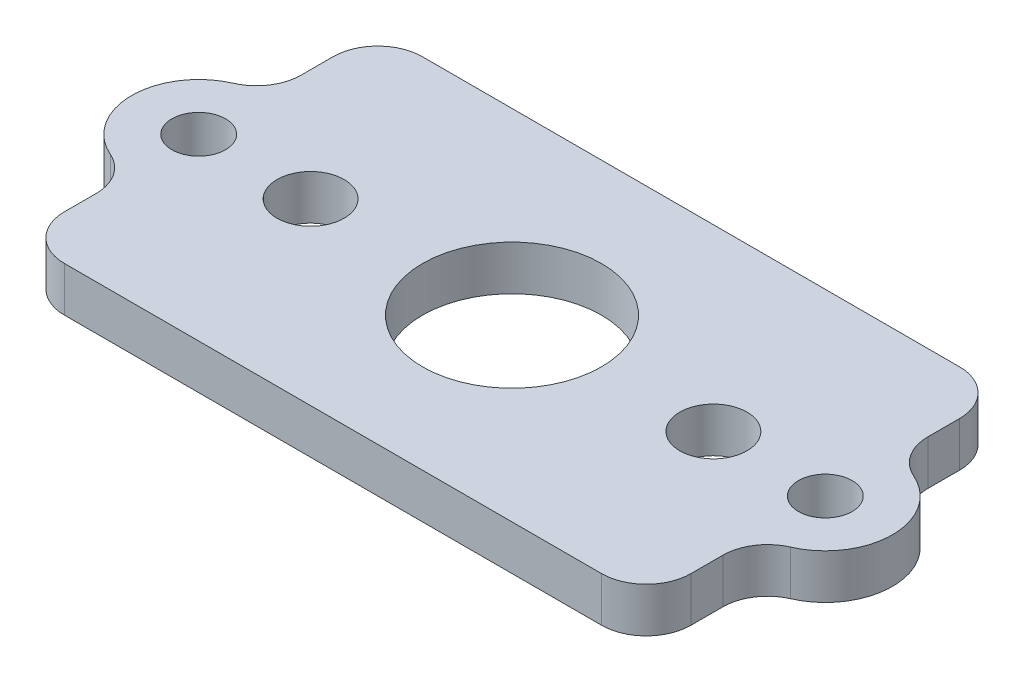
ISO-10303-21;
HEADER;
FILE_DESCRIPTION(('STEP AP214'),'2;1');
FILE_NAME('part.step','',(''),(''),'','','');
FILE_SCHEMA(('AUTOMOTIVE_DESIGN { 1 0 10303 214 1 1 1 1 }'));
ENDSEC;
DATA;
#1=APPLICATION_CONTEXT('core data for automotive mechanical design processes');
#2=APPLICATION_PROTOCOL_DEFINITION('international standard','automotive_design',2000,#1);
#3=PRODUCT_CONTEXT('',#1,'mechanical');
#4=PRODUCT('Part','Part','',(#3));
#5=PRODUCT_RELATED_PRODUCT_CATEGORY('part','',(#4));
#6=PRODUCT_DEFINITION_FORMATION('','',#4);
#7=PRODUCT_DEFINITION_CONTEXT('part definition',#1,'design');
#8=PRODUCT_DEFINITION('design','',#6,#7);
#9=PRODUCT_DEFINITION_SHAPE('','',#8);
#10=(LENGTH_UNIT() NAMED_UNIT(*) SI_UNIT(.MILLI.,.METRE.));
#11=(NAMED_UNIT(*) PLANE_ANGLE_UNIT() SI_UNIT($,.RADIAN.));
#12=(NAMED_UNIT(*) SI_UNIT($,.STERADIAN.) SOLID_ANGLE_UNIT());
#13=UNCERTAINTY_MEASURE_WITH_UNIT(LENGTH_MEASURE(1.E-05),#10,'distance_accuracy_value','');
#14=(GEOMETRIC_REPRESENTATION_CONTEXT(3) GLOBAL_UNCERTAINTY_ASSIGNED_CONTEXT((#13)) GLOBAL_UNIT_ASSIGNED_CONTEXT((#10,
#11,#12)) REPRESENTATION_CONTEXT('',''));
#15=CARTESIAN_POINT('',(0.,0.,0.));
#16=DIRECTION('',(0.,0.,1.));
#17=DIRECTION('',(1.,0.,0.));
#18=AXIS2_PLACEMENT_3D('',#15,#16,#17);
#19=CARTESIAN_POINT('',(0.,0.,4.));
#20=DIRECTION('',(0.,1.,0.));
#21=DIRECTION('',(-1.,0.,0.));
#22=AXIS2_PLACEMENT_3D('',#19,#20,#21);
#23=PLANE('',#22);
#24=DIRECTION('',(0.,0.,-1.));
#25=VECTOR('',#24,1.);
#26=CARTESIAN_POINT('',(7.,0.,4.));
#27=LINE('',#26,#25);
#28=CARTESIAN_POINT('',(7.,0.,3.));
#29=VERTEX_POINT('',#28);
#30=CARTESIAN_POINT('',(7.,0.,2.29128784747792));
#31=VERTEX_POINT('',#30);
#32=EDGE_CURVE('E175',#29,#31,#27,.T.);
#33=ORIENTED_EDGE('',*,*,#32,.F.);
#34=CARTESIAN_POINT('',(6.,0.,3.));
#35=DIRECTION('',(0.,1.,0.));
#36=DIRECTION('',(-1.,0.,0.));
#37=AXIS2_PLACEMENT_3D('',#34,#35,#36);
#38=CIRCLE('',#37,1.);
#39=CARTESIAN_POINT('',(6.,0.,4.));
#40=VERTEX_POINT('',#39);
#41=EDGE_CURVE('E251',#29,#40,#38,.F.);
#42=ORIENTED_EDGE('',*,*,#41,.T.);
#43=DIRECTION('',(1.,0.,0.));
#44=VECTOR('',#43,1.);
#45=CARTESIAN_POINT('',(7.,0.,4.));
#46=LINE('',#45,#44);
#47=CARTESIAN_POINT('',(-6.,0.,4.));
#48=VERTEX_POINT('',#47);
#49=EDGE_CURVE('E194',#48,#40,#46,.T.);
#50=ORIENTED_EDGE('',*,*,#49,.F.);
#51=CARTESIAN_POINT('',(-6.,0.,3.));
#52=DIRECTION('',(0.,1.,0.));
#53=DIRECTION('',(-1.,0.,0.));
#54=AXIS2_PLACEMENT_3D('',#51,#52,#53);
#55=CIRCLE('',#54,1.);
#56=CARTESIAN_POINT('',(-7.,0.,3.));
#57=VERTEX_POINT('',#56);
#58=EDGE_CURVE('E248',#48,#57,#55,.F.);
#59=ORIENTED_EDGE('',*,*,#58,.T.);
#60=DIRECTION('',(0.,0.,-1.));
#61=VECTOR('',#60,1.);
#62=CARTESIAN_POINT('',(-7.,0.,4.));
#63=LINE('',#62,#61);
#64=CARTESIAN_POINT('',(-7.,0.,2.29128784747792));
#65=VERTEX_POINT('',#64);
#66=EDGE_CURVE('E199',#57,#65,#63,.T.);
#67=ORIENTED_EDGE('',*,*,#66,.T.);
#68=CARTESIAN_POINT('',(-8.,0.,2.29128784747792));
#69=DIRECTION('',(0.,1.,0.));
#70=DIRECTION('',(-1.,0.,0.));
#71=AXIS2_PLACEMENT_3D('',#68,#69,#70);
#72=CIRCLE('',#71,1.);
#73=CARTESIAN_POINT('',(-7.6,0.,1.37477270848675));
#74=VERTEX_POINT('',#73);
#75=EDGE_CURVE('E226',#65,#74,#72,.T.);
#76=ORIENTED_EDGE('',*,*,#75,.T.);
#77=CARTESIAN_POINT('',(-7.,0.,0.));
#78=DIRECTION('',(0.,-1.,0.));
#79=DIRECTION('',(1.,0.,0.));
#80=AXIS2_PLACEMENT_3D('',#77,#78,#79);
#81=CIRCLE('',#80,1.5);
#82=CARTESIAN_POINT('',(-7.6,0.,-1.37477270848675));
#83=VERTEX_POINT('',#82);
#84=EDGE_CURVE('E184',#74,#83,#81,.T.);
#85=ORIENTED_EDGE('',*,*,#84,.T.);
#86=CARTESIAN_POINT('',(-8.,0.,-2.29128784747792));
#87=DIRECTION('',(0.,1.,0.));
#88=DIRECTION('',(-1.,0.,0.));
#89=AXIS2_PLACEMENT_3D('',#86,#87,#88);
#90=CIRCLE('',#89,1.);
#91=CARTESIAN_POINT('',(-7.,0.,-2.29128784747792));
#92=VERTEX_POINT('',#91);
#93=EDGE_CURVE('E224',#83,#92,#90,.T.);
#94=ORIENTED_EDGE('',*,*,#93,.T.);
#95=CARTESIAN_POINT('',(-7.,0.,-3.));
#96=VERTEX_POINT('',#95);
#97=EDGE_CURVE('E197',#92,#96,#63,.T.);
#98=ORIENTED_EDGE('',*,*,#97,.T.);
#99=CARTESIAN_POINT('',(-6.,0.,-3.));
#100=DIRECTION('',(0.,1.,0.));
#101=DIRECTION('',(-1.,0.,0.));
#102=AXIS2_PLACEMENT_3D('',#99,#100,#101);
#103=CIRCLE('',#102,1.);
#104=CARTESIAN_POINT('',(-6.,0.,-4.));
#105=VERTEX_POINT('',#104);
#106=EDGE_CURVE('E246',#96,#105,#103,.F.);
#107=ORIENTED_EDGE('',*,*,#106,.T.);
#108=DIRECTION('',(1.,0.,0.));
#109=VECTOR('',#108,1.);
#110=CARTESIAN_POINT('',(0.,0.,-4.));
#111=LINE('',#110,#109);
#112=CARTESIAN_POINT('',(6.,0.,-4.));
#113=VERTEX_POINT('',#112);
#114=EDGE_CURVE('E193',#105,#113,#111,.T.);
#115=ORIENTED_EDGE('',*,*,#114,.T.);
#116=CARTESIAN_POINT('',(6.,0.,-3.));
#117=DIRECTION('',(0.,1.,0.));
#118=DIRECTION('',(-1.,0.,0.));
#119=AXIS2_PLACEMENT_3D('',#116,#117,#118);
#120=CIRCLE('',#119,1.);
#121=CARTESIAN_POINT('',(7.,0.,-3.));
#122=VERTEX_POINT('',#121);
#123=EDGE_CURVE('E52',#113,#122,#120,.F.);
#124=ORIENTED_EDGE('',*,*,#123,.T.);
#125=CARTESIAN_POINT('',(7.,0.,-2.29128784747792));
#126=VERTEX_POINT('',#125);
#127=EDGE_CURVE('E201',#126,#122,#27,.T.);
#128=ORIENTED_EDGE('',*,*,#127,.F.);
#129=CARTESIAN_POINT('',(8.,0.,-2.29128784747792));
#130=DIRECTION('',(0.,1.,0.));
#131=DIRECTION('',(-1.,0.,0.));
#132=AXIS2_PLACEMENT_3D('',#129,#130,#131);
#133=CIRCLE('',#132,1.);
#134=CARTESIAN_POINT('',(7.6,0.,-1.37477270848675));
#135=VERTEX_POINT('',#134);
#136=EDGE_CURVE('E163',#126,#135,#133,.T.);
#137=ORIENTED_EDGE('',*,*,#136,.T.);
#138=CARTESIAN_POINT('',(7.,0.,0.));
#139=DIRECTION('',(0.,-1.,0.));
#140=DIRECTION('',(1.,0.,0.));
#141=AXIS2_PLACEMENT_3D('',#138,#139,#140);
#142=CIRCLE('',#141,1.5);
#143=CARTESIAN_POINT('',(7.6,0.,1.37477270848675));
#144=VERTEX_POINT('',#143);
#145=EDGE_CURVE('E170',#144,#135,#142,.F.);
#146=ORIENTED_EDGE('',*,*,#145,.F.);
#147=CARTESIAN_POINT('',(8.,0.,2.29128784747792));
#148=DIRECTION('',(0.,1.,0.));
#149=DIRECTION('',(-1.,0.,0.));
#150=AXIS2_PLACEMENT_3D('',#147,#148,#149);
#151=CIRCLE('',#150,1.);
#152=EDGE_CURVE('E154',#144,#31,#151,.T.);
#153=ORIENTED_EDGE('',*,*,#152,.T.);
#154=EDGE_LOOP('',(#33,#42,#50,#59,#67,#76,#85,#94,#98,#107,#115,#124,#128,#137,#146,#153));
#155=FACE_BOUND('',#154,.T.);
#156=CARTESIAN_POINT('',(7.,0.,0.));
#157=DIRECTION('',(0.,-1.,0.));
#158=DIRECTION('',(1.,0.,0.));
#159=AXIS2_PLACEMENT_3D('',#156,#157,#158);
#160=CIRCLE('',#159,0.6);
#161=CARTESIAN_POINT('',(7.6,0.,0.));
#162=VERTEX_POINT('',#161);
#163=EDGE_CURVE('E298',#162,#162,#160,.T.);
#164=ORIENTED_EDGE('',*,*,#163,.F.);
#165=EDGE_LOOP('',(#164));
#166=FACE_BOUND('',#165,.T.);
#167=CARTESIAN_POINT('',(-7.,0.,0.));
#168=DIRECTION('',(0.,-1.,0.));
#169=DIRECTION('',(1.,0.,0.));
#170=AXIS2_PLACEMENT_3D('',#167,#168,#169);
#171=CIRCLE('',#170,0.6);
#172=CARTESIAN_POINT('',(-6.4,0.,0.));
#173=VERTEX_POINT('',#172);
#174=EDGE_CURVE('E303',#173,#173,#171,.T.);
#175=ORIENTED_EDGE('',*,*,#174,.F.);
#176=EDGE_LOOP('',(#175));
#177=FACE_BOUND('',#176,.T.);
#178=CARTESIAN_POINT('',(0.,0.,0.));
#179=DIRECTION('',(0.,-1.,0.));
#180=DIRECTION('',(1.,0.,0.));
#181=AXIS2_PLACEMENT_3D('',#178,#179,#180);
#182=CIRCLE('',#181,2.);
#183=CARTESIAN_POINT('',(2.,0.,0.));
#184=VERTEX_POINT('',#183);
#185=EDGE_CURVE('E287',#184,#184,#182,.T.);
#186=ORIENTED_EDGE('',*,*,#185,.F.);
#187=EDGE_LOOP('',(#186));
#188=FACE_BOUND('',#187,.T.);
#189=CARTESIAN_POINT('',(4.5,0.,0.));
#190=DIRECTION('',(0.,1.,0.));
#191=DIRECTION('',(0.,0.,1.));
#192=AXIS2_PLACEMENT_3D('',#189,#190,#191);
#193=CIRCLE('',#192,0.75);
#194=CARTESIAN_POINT('',(4.5,0.,0.75));
#195=VERTEX_POINT('',#194);
#196=EDGE_CURVE('E410',#195,#195,#193,.F.);
#197=ORIENTED_EDGE('',*,*,#196,.F.);
#198=EDGE_LOOP('',(#197));
#199=FACE_BOUND('',#198,.T.);
#200=CARTESIAN_POINT('',(-4.5,0.,0.));
#201=DIRECTION('',(0.,1.,0.));
#202=DIRECTION('',(0.,0.,1.));
#203=AXIS2_PLACEMENT_3D('',#200,#201,#202);
#204=CIRCLE('',#203,0.75);
#205=CARTESIAN_POINT('',(-4.5,0.,0.75));
#206=VERTEX_POINT('',#205);
#207=EDGE_CURVE('E293',#206,#206,#204,.T.);
#208=ORIENTED_EDGE('',*,*,#207,.T.);
#209=EDGE_LOOP('',(#208));
#210=FACE_BOUND('',#209,.T.);
#211=ADVANCED_FACE('F37',(#155,#166,#177,#188,#199,#210),#23,.F.);
#212=CARTESIAN_POINT('',(-7.,1.,0.));
#213=DIRECTION('',(0.,1.,0.));
#214=DIRECTION('',(0.,0.,1.));
#215=AXIS2_PLACEMENT_3D('',#212,#213,#214);
#216=PLANE('',#215);
#217=CARTESIAN_POINT('',(4.5,1.,0.));
#218=DIRECTION('',(0.,1.,0.));
#219=DIRECTION('',(0.,0.,1.));
#220=AXIS2_PLACEMENT_3D('',#217,#218,#219);
#221=CIRCLE('',#220,0.75);
#222=CARTESIAN_POINT('',(4.5,1.,0.75));
#223=VERTEX_POINT('',#222);
#224=EDGE_CURVE('E414',#223,#223,#221,.F.);
#225=ORIENTED_EDGE('',*,*,#224,.T.);
#226=EDGE_LOOP('',(#225));
#227=FACE_BOUND('',#226,.T.);
#228=CARTESIAN_POINT('',(0.,1.,0.));
#229=DIRECTION('',(0.,-1.,0.));
#230=DIRECTION('',(1.,0.,0.));
#231=AXIS2_PLACEMENT_3D('',#228,#229,#230);
#232=CIRCLE('',#231,2.);
#233=CARTESIAN_POINT('',(2.,1.,0.));
#234=VERTEX_POINT('',#233);
#235=EDGE_CURVE('E291',#234,#234,#232,.T.);
#236=ORIENTED_EDGE('',*,*,#235,.T.);
#237=EDGE_LOOP('',(#236));
#238=FACE_BOUND('',#237,.T.);
#239=CARTESIAN_POINT('',(-7.,0.999999999999999,0.));
#240=DIRECTION('',(0.,-1.,0.));
#241=DIRECTION('',(1.,0.,0.));
#242=AXIS2_PLACEMENT_3D('',#239,#240,#241);
#243=CIRCLE('',#242,0.6);
#244=CARTESIAN_POINT('',(-6.4,0.999999999999999,0.));
#245=VERTEX_POINT('',#244);
#246=EDGE_CURVE('E300',#245,#245,#243,.T.);
#247=ORIENTED_EDGE('',*,*,#246,.T.);
#248=EDGE_LOOP('',(#247));
#249=FACE_BOUND('',#248,.T.);
#250=CARTESIAN_POINT('',(7.,1.,0.));
#251=DIRECTION('',(0.,-1.,0.));
#252=DIRECTION('',(1.,0.,0.));
#253=AXIS2_PLACEMENT_3D('',#250,#251,#252);
#254=CIRCLE('',#253,0.6);
#255=CARTESIAN_POINT('',(7.6,1.,0.));
#256=VERTEX_POINT('',#255);
#257=EDGE_CURVE('E306',#256,#256,#254,.T.);
#258=ORIENTED_EDGE('',*,*,#257,.T.);
#259=EDGE_LOOP('',(#258));
#260=FACE_BOUND('',#259,.T.);
#261=DIRECTION('',(1.,0.,0.));
#262=VECTOR('',#261,1.);
#263=CARTESIAN_POINT('',(0.,1.,4.));
#264=LINE('',#263,#262);
#265=CARTESIAN_POINT('',(-6.,1.,4.));
#266=VERTEX_POINT('',#265);
#267=CARTESIAN_POINT('',(6.,1.,4.));
#268=VERTEX_POINT('',#267);
#269=EDGE_CURVE('E280',#266,#268,#264,.T.);
#270=ORIENTED_EDGE('',*,*,#269,.T.);
#271=CARTESIAN_POINT('',(6.,1.,3.));
#272=DIRECTION('',(0.,1.,0.));
#273=DIRECTION('',(0.,0.,1.));
#274=AXIS2_PLACEMENT_3D('',#271,#272,#273);
#275=CIRCLE('',#274,1.);
#276=CARTESIAN_POINT('',(7.,1.,3.));
#277=VERTEX_POINT('',#276);
#278=EDGE_CURVE('E242',#268,#277,#275,.T.);
#279=ORIENTED_EDGE('',*,*,#278,.T.);
#280=DIRECTION('',(0.,0.,1.));
#281=VECTOR('',#280,1.);
#282=CARTESIAN_POINT('',(7.,1.,0.));
#283=LINE('',#282,#281);
#284=CARTESIAN_POINT('',(7.,1.,2.29128784747792));
#285=VERTEX_POINT('',#284);
#286=EDGE_CURVE('E181',#285,#277,#283,.T.);
#287=ORIENTED_EDGE('',*,*,#286,.F.);
#288=CARTESIAN_POINT('',(8.,1.,2.29128784747792));
#289=DIRECTION('',(0.,1.,0.));
#290=DIRECTION('',(0.,0.,1.));
#291=AXIS2_PLACEMENT_3D('',#288,#289,#290);
#292=CIRCLE('',#291,1.);
#293=CARTESIAN_POINT('',(7.6,1.,1.37477270848675));
#294=VERTEX_POINT('',#293);
#295=EDGE_CURVE('E162',#285,#294,#292,.F.);
#296=ORIENTED_EDGE('',*,*,#295,.T.);
#297=CARTESIAN_POINT('',(7.,1.,0.));
#298=DIRECTION('',(0.,-1.,0.));
#299=DIRECTION('',(1.,0.,0.));
#300=AXIS2_PLACEMENT_3D('',#297,#298,#299);
#301=CIRCLE('',#300,1.5);
#302=CARTESIAN_POINT('',(7.6,1.,-1.37477270848675));
#303=VERTEX_POINT('',#302);
#304=EDGE_CURVE('E173',#294,#303,#301,.F.);
#305=ORIENTED_EDGE('',*,*,#304,.T.);
#306=CARTESIAN_POINT('',(8.,1.,-2.29128784747792));
#307=DIRECTION('',(0.,1.,0.));
#308=DIRECTION('',(0.,0.,1.));
#309=AXIS2_PLACEMENT_3D('',#306,#307,#308);
#310=CIRCLE('',#309,1.);
#311=CARTESIAN_POINT('',(7.,1.,-2.29128784747792));
#312=VERTEX_POINT('',#311);
#313=EDGE_CURVE('E217',#303,#312,#310,.F.);
#314=ORIENTED_EDGE('',*,*,#313,.T.);
#315=CARTESIAN_POINT('',(7.,1.,-3.));
#316=VERTEX_POINT('',#315);
#317=EDGE_CURVE('E188',#316,#312,#283,.T.);
#318=ORIENTED_EDGE('',*,*,#317,.F.);
#319=CARTESIAN_POINT('',(6.,0.999999999999999,-3.));
#320=DIRECTION('',(0.,1.,0.));
#321=DIRECTION('',(0.,0.,1.));
#322=AXIS2_PLACEMENT_3D('',#319,#320,#321);
#323=CIRCLE('',#322,1.);
#324=CARTESIAN_POINT('',(6.,1.,-4.));
#325=VERTEX_POINT('',#324);
#326=EDGE_CURVE('E240',#316,#325,#323,.T.);
#327=ORIENTED_EDGE('',*,*,#326,.T.);
#328=DIRECTION('',(1.,0.,0.));
#329=VECTOR('',#328,1.);
#330=CARTESIAN_POINT('',(0.,1.,-4.));
#331=LINE('',#330,#329);
#332=CARTESIAN_POINT('',(-6.,1.,-4.));
#333=VERTEX_POINT('',#332);
#334=EDGE_CURVE('E288',#333,#325,#331,.T.);
#335=ORIENTED_EDGE('',*,*,#334,.F.);
#336=CARTESIAN_POINT('',(-6.,1.,-3.));
#337=DIRECTION('',(0.,1.,0.));
#338=DIRECTION('',(0.,0.,1.));
#339=AXIS2_PLACEMENT_3D('',#336,#337,#338);
#340=CIRCLE('',#339,1.);
#341=CARTESIAN_POINT('',(-7.,1.,-3.));
#342=VERTEX_POINT('',#341);
#343=EDGE_CURVE('E236',#333,#342,#340,.T.);
#344=ORIENTED_EDGE('',*,*,#343,.T.);
#345=DIRECTION('',(0.,0.,1.));
#346=VECTOR('',#345,1.);
#347=CARTESIAN_POINT('',(-7.,1.,0.));
#348=LINE('',#347,#346);
#349=CARTESIAN_POINT('',(-7.,1.,-2.29128784747792));
#350=VERTEX_POINT('',#349);
#351=EDGE_CURVE('E191',#342,#350,#348,.T.);
#352=ORIENTED_EDGE('',*,*,#351,.T.);
#353=CARTESIAN_POINT('',(-8.,1.,-2.29128784747792));
#354=DIRECTION('',(0.,1.,0.));
#355=DIRECTION('',(0.,0.,1.));
#356=AXIS2_PLACEMENT_3D('',#353,#354,#355);
#357=CIRCLE('',#356,1.);
#358=CARTESIAN_POINT('',(-7.6,0.999999999999999,-1.37477270848675));
#359=VERTEX_POINT('',#358);
#360=EDGE_CURVE('E222',#350,#359,#357,.F.);
#361=ORIENTED_EDGE('',*,*,#360,.T.);
#362=CARTESIAN_POINT('',(-7.,0.999999999999999,0.));
#363=DIRECTION('',(0.,-1.,0.));
#364=DIRECTION('',(1.,0.,0.));
#365=AXIS2_PLACEMENT_3D('',#362,#363,#364);
#366=CIRCLE('',#365,1.5);
#367=CARTESIAN_POINT('',(-7.6,0.999999999999999,1.37477270848675));
#368=VERTEX_POINT('',#367);
#369=EDGE_CURVE('E179',#368,#359,#366,.T.);
#370=ORIENTED_EDGE('',*,*,#369,.F.);
#371=CARTESIAN_POINT('',(-8.,1.,2.29128784747792));
#372=DIRECTION('',(0.,1.,0.));
#373=DIRECTION('',(0.,0.,1.));
#374=AXIS2_PLACEMENT_3D('',#371,#372,#373);
#375=CIRCLE('',#374,1.);
#376=CARTESIAN_POINT('',(-7.,1.,2.29128784747792));
#377=VERTEX_POINT('',#376);
#378=EDGE_CURVE('E228',#368,#377,#375,.F.);
#379=ORIENTED_EDGE('',*,*,#378,.T.);
#380=CARTESIAN_POINT('',(-7.,1.,3.));
#381=VERTEX_POINT('',#380);
#382=EDGE_CURVE('E190',#377,#381,#348,.T.);
#383=ORIENTED_EDGE('',*,*,#382,.T.);
#384=CARTESIAN_POINT('',(-6.,1.,3.));
#385=DIRECTION('',(0.,1.,0.));
#386=DIRECTION('',(0.,0.,1.));
#387=AXIS2_PLACEMENT_3D('',#384,#385,#386);
#388=CIRCLE('',#387,1.);
#389=EDGE_CURVE('E238',#381,#266,#388,.T.);
#390=ORIENTED_EDGE('',*,*,#389,.T.);
#391=EDGE_LOOP('',(#270,#279,#287,#296,#305,#314,#318,#327,#335,#344,#352,#361,#370,#379,#383,#390));
#392=FACE_BOUND('',#391,.T.);
#393=CARTESIAN_POINT('',(-4.5,1.,0.));
#394=DIRECTION('',(0.,1.,0.));
#395=DIRECTION('',(0.,0.,1.));
#396=AXIS2_PLACEMENT_3D('',#393,#394,#395);
#397=CIRCLE('',#396,0.75);
#398=CARTESIAN_POINT('',(-4.5,1.,0.75));
#399=VERTEX_POINT('',#398);
#400=EDGE_CURVE('E409',#399,#399,#397,.T.);
#401=ORIENTED_EDGE('',*,*,#400,.F.);
#402=EDGE_LOOP('',(#401));
#403=FACE_BOUND('',#402,.T.);
#404=ADVANCED_FACE('F269',(#227,#238,#249,#260,#392,#403),#216,.T.);
#405=CARTESIAN_POINT('',(-7.,0.,4.));
#406=DIRECTION('',(1.,0.,0.));
#407=DIRECTION('',(0.,0.,-1.));
#408=AXIS2_PLACEMENT_3D('',#405,#406,#407);
#409=PLANE('',#408);
#410=ORIENTED_EDGE('',*,*,#66,.F.);
#411=DIRECTION('',(0.,-1.,0.));
#412=VECTOR('',#411,1.);
#413=CARTESIAN_POINT('',(-7.,0.,3.));
#414=LINE('',#413,#412);
#415=EDGE_CURVE('E45',#57,#381,#414,.F.);
#416=ORIENTED_EDGE('',*,*,#415,.T.);
#417=ORIENTED_EDGE('',*,*,#382,.F.);
#418=DIRECTION('',(0.,-1.,0.));
#419=VECTOR('',#418,1.);
#420=CARTESIAN_POINT('',(-7.,0.,2.29128784747792));
#421=LINE('',#420,#419);
#422=EDGE_CURVE('E214',#377,#65,#421,.T.);
#423=ORIENTED_EDGE('',*,*,#422,.T.);
#424=EDGE_LOOP('',(#410,#416,#417,#423));
#425=FACE_BOUND('',#424,.T.);
#426=ADVANCED_FACE('F263',(#425),#409,.F.);
#427=CARTESIAN_POINT('',(7.,8.,4.));
#428=DIRECTION('',(-1.,0.,0.));
#429=DIRECTION('',(0.,-1.,0.));
#430=AXIS2_PLACEMENT_3D('',#427,#428,#429);
#431=PLANE('',#430);
#432=ORIENTED_EDGE('',*,*,#127,.T.);
#433=DIRECTION('',(0.,1.,0.));
#434=VECTOR('',#433,1.);
#435=CARTESIAN_POINT('',(7.,0.999999999999999,-3.));
#436=LINE('',#435,#434);
#437=EDGE_CURVE('E253',#122,#316,#436,.T.);
#438=ORIENTED_EDGE('',*,*,#437,.T.);
#439=ORIENTED_EDGE('',*,*,#317,.T.);
#440=DIRECTION('',(0.,1.,0.));
#441=VECTOR('',#440,1.);
#442=CARTESIAN_POINT('',(7.,0.,-2.29128784747792));
#443=LINE('',#442,#441);
#444=EDGE_CURVE('E204',#312,#126,#443,.F.);
#445=ORIENTED_EDGE('',*,*,#444,.T.);
#446=EDGE_LOOP('',(#432,#438,#439,#445));
#447=FACE_BOUND('',#446,.T.);
#448=ADVANCED_FACE('F337',(#447),#431,.F.);
#449=ORIENTED_EDGE('',*,*,#286,.T.);
#450=DIRECTION('',(0.,1.,0.));
#451=VECTOR('',#450,1.);
#452=CARTESIAN_POINT('',(7.,8.,3.));
#453=LINE('',#452,#451);
#454=EDGE_CURVE('E244',#277,#29,#453,.F.);
#455=ORIENTED_EDGE('',*,*,#454,.T.);
#456=ORIENTED_EDGE('',*,*,#32,.T.);
#457=DIRECTION('',(0.,1.,0.));
#458=VECTOR('',#457,1.);
#459=CARTESIAN_POINT('',(7.,1.,2.29128784747792));
#460=LINE('',#459,#458);
#461=EDGE_CURVE('E159',#31,#285,#460,.T.);
#462=ORIENTED_EDGE('',*,*,#461,.T.);
#463=EDGE_LOOP('',(#449,#455,#456,#462));
#464=FACE_BOUND('',#463,.T.);
#465=ADVANCED_FACE('F365',(#464),#431,.F.);
#466=ORIENTED_EDGE('',*,*,#351,.F.);
#467=DIRECTION('',(0.,-1.,0.));
#468=VECTOR('',#467,1.);
#469=CARTESIAN_POINT('',(-7.,0.,-3.));
#470=LINE('',#469,#468);
#471=EDGE_CURVE('E11',#342,#96,#470,.T.);
#472=ORIENTED_EDGE('',*,*,#471,.T.);
#473=ORIENTED_EDGE('',*,*,#97,.F.);
#474=DIRECTION('',(0.,-1.,0.));
#475=VECTOR('',#474,1.);
#476=CARTESIAN_POINT('',(-7.,0.,-2.29128784747792));
#477=LINE('',#476,#475);
#478=EDGE_CURVE('E207',#92,#350,#477,.F.);
#479=ORIENTED_EDGE('',*,*,#478,.T.);
#480=EDGE_LOOP('',(#466,#472,#473,#479));
#481=FACE_BOUND('',#480,.T.);
#482=ADVANCED_FACE('F325',(#481),#409,.F.);
#483=CARTESIAN_POINT('',(0.,0.,4.));
#484=DIRECTION('',(0.,0.,-1.));
#485=DIRECTION('',(-1.,0.,0.));
#486=AXIS2_PLACEMENT_3D('',#483,#484,#485);
#487=PLANE('',#486);
#488=ORIENTED_EDGE('',*,*,#49,.T.);
#489=DIRECTION('',(0.,1.,0.));
#490=VECTOR('',#489,1.);
#491=CARTESIAN_POINT('',(6.,0.,4.));
#492=LINE('',#491,#490);
#493=EDGE_CURVE('E233',#40,#268,#492,.T.);
#494=ORIENTED_EDGE('',*,*,#493,.T.);
#495=ORIENTED_EDGE('',*,*,#269,.F.);
#496=DIRECTION('',(0.,-1.,0.));
#497=VECTOR('',#496,1.);
#498=CARTESIAN_POINT('',(-6.,0.,4.));
#499=LINE('',#498,#497);
#500=EDGE_CURVE('E230',#266,#48,#499,.T.);
#501=ORIENTED_EDGE('',*,*,#500,.T.);
#502=EDGE_LOOP('',(#488,#494,#495,#501));
#503=FACE_BOUND('',#502,.T.);
#504=ADVANCED_FACE('F278',(#503),#487,.F.);
#505=CARTESIAN_POINT('',(0.,0.,-4.));
#506=DIRECTION('',(0.,0.,-1.));
#507=DIRECTION('',(-1.,0.,0.));
#508=AXIS2_PLACEMENT_3D('',#505,#506,#507);
#509=PLANE('',#508);
#510=ORIENTED_EDGE('',*,*,#334,.T.);
#511=DIRECTION('',(0.,1.,0.));
#512=VECTOR('',#511,1.);
#513=CARTESIAN_POINT('',(6.,0.,-4.));
#514=LINE('',#513,#512);
#515=EDGE_CURVE('E60',#325,#113,#514,.F.);
#516=ORIENTED_EDGE('',*,*,#515,.T.);
#517=ORIENTED_EDGE('',*,*,#114,.F.);
#518=DIRECTION('',(0.,-1.,0.));
#519=VECTOR('',#518,1.);
#520=CARTESIAN_POINT('',(-6.,1.,-4.));
#521=LINE('',#520,#519);
#522=EDGE_CURVE('E256',#105,#333,#521,.F.);
#523=ORIENTED_EDGE('',*,*,#522,.T.);
#524=EDGE_LOOP('',(#510,#516,#517,#523));
#525=FACE_BOUND('',#524,.T.);
#526=ADVANCED_FACE('F329',(#525),#509,.T.);
#527=CARTESIAN_POINT('',(7.,1.,0.));
#528=DIRECTION('',(0.,-1.,0.));
#529=DIRECTION('',(1.,0.,0.));
#530=AXIS2_PLACEMENT_3D('',#527,#528,#529);
#531=CYLINDRICAL_SURFACE('',#530,1.5);
#532=ORIENTED_EDGE('',*,*,#145,.T.);
#533=DIRECTION('',(0.,-1.,0.));
#534=VECTOR('',#533,1.);
#535=CARTESIAN_POINT('',(7.6,1.,-1.37477270848675));
#536=LINE('',#535,#534);
#537=EDGE_CURVE('E174',#135,#303,#536,.F.);
#538=ORIENTED_EDGE('',*,*,#537,.T.);
#539=ORIENTED_EDGE('',*,*,#304,.F.);
#540=DIRECTION('',(0.,-1.,0.));
#541=VECTOR('',#540,1.);
#542=CARTESIAN_POINT('',(7.6,1.,1.37477270848675));
#543=LINE('',#542,#541);
#544=EDGE_CURVE('E158',#294,#144,#543,.T.);
#545=ORIENTED_EDGE('',*,*,#544,.T.);
#546=EDGE_LOOP('',(#532,#538,#539,#545));
#547=FACE_BOUND('',#546,.T.);
#548=ADVANCED_FACE('F168',(#547),#531,.T.);
#549=CARTESIAN_POINT('',(-7.,0.999999999999999,0.));
#550=DIRECTION('',(0.,-1.,0.));
#551=DIRECTION('',(1.,0.,0.));
#552=AXIS2_PLACEMENT_3D('',#549,#550,#551);
#553=CYLINDRICAL_SURFACE('',#552,1.5);
#554=ORIENTED_EDGE('',*,*,#369,.T.);
#555=DIRECTION('',(0.,-1.,0.));
#556=VECTOR('',#555,1.);
#557=CARTESIAN_POINT('',(-7.6,0.999999999999999,-1.37477270848675));
#558=LINE('',#557,#556);
#559=EDGE_CURVE('E212',#359,#83,#558,.T.);
#560=ORIENTED_EDGE('',*,*,#559,.T.);
#561=ORIENTED_EDGE('',*,*,#84,.F.);
#562=DIRECTION('',(0.,-1.,0.));
#563=VECTOR('',#562,1.);
#564=CARTESIAN_POINT('',(-7.6,0.999999999999999,1.37477270848675));
#565=LINE('',#564,#563);
#566=EDGE_CURVE('E210',#74,#368,#565,.F.);
#567=ORIENTED_EDGE('',*,*,#566,.T.);
#568=EDGE_LOOP('',(#554,#560,#561,#567));
#569=FACE_BOUND('',#568,.T.);
#570=ADVANCED_FACE('F382',(#569),#553,.T.);
#571=CARTESIAN_POINT('',(7.,1.,0.));
#572=DIRECTION('',(0.,-1.,0.));
#573=DIRECTION('',(1.,0.,0.));
#574=AXIS2_PLACEMENT_3D('',#571,#572,#573);
#575=CYLINDRICAL_SURFACE('',#574,0.6);
#576=ORIENTED_EDGE('',*,*,#257,.F.);
#577=EDGE_LOOP('',(#576));
#578=FACE_BOUND('',#577,.T.);
#579=ORIENTED_EDGE('',*,*,#163,.T.);
#580=EDGE_LOOP('',(#579));
#581=FACE_BOUND('',#580,.T.);
#582=ADVANCED_FACE('F349',(#578,#581),#575,.F.);
#583=CARTESIAN_POINT('',(-7.,0.999999999999999,0.));
#584=DIRECTION('',(0.,-1.,0.));
#585=DIRECTION('',(1.,0.,0.));
#586=AXIS2_PLACEMENT_3D('',#583,#584,#585);
#587=CYLINDRICAL_SURFACE('',#586,0.6);
#588=ORIENTED_EDGE('',*,*,#246,.F.);
#589=EDGE_LOOP('',(#588));
#590=FACE_BOUND('',#589,.T.);
#591=ORIENTED_EDGE('',*,*,#174,.T.);
#592=EDGE_LOOP('',(#591));
#593=FACE_BOUND('',#592,.T.);
#594=ADVANCED_FACE('F342',(#590,#593),#587,.F.);
#595=CARTESIAN_POINT('',(8.,1.,-2.29128784747792));
#596=DIRECTION('',(0.,-1.,0.));
#597=DIRECTION('',(1.,0.,0.));
#598=AXIS2_PLACEMENT_3D('',#595,#596,#597);
#599=CYLINDRICAL_SURFACE('',#598,1.);
#600=ORIENTED_EDGE('',*,*,#136,.F.);
#601=ORIENTED_EDGE('',*,*,#444,.F.);
#602=ORIENTED_EDGE('',*,*,#313,.F.);
#603=ORIENTED_EDGE('',*,*,#537,.F.);
#604=EDGE_LOOP('',(#600,#601,#602,#603));
#605=FACE_BOUND('',#604,.T.);
#606=ADVANCED_FACE('F340',(#605),#599,.F.);
#607=CARTESIAN_POINT('',(8.,1.,2.29128784747792));
#608=DIRECTION('',(0.,-1.,0.));
#609=DIRECTION('',(1.,0.,0.));
#610=AXIS2_PLACEMENT_3D('',#607,#608,#609);
#611=CYLINDRICAL_SURFACE('',#610,1.);
#612=ORIENTED_EDGE('',*,*,#295,.F.);
#613=ORIENTED_EDGE('',*,*,#461,.F.);
#614=ORIENTED_EDGE('',*,*,#152,.F.);
#615=ORIENTED_EDGE('',*,*,#544,.F.);
#616=EDGE_LOOP('',(#612,#613,#614,#615));
#617=FACE_BOUND('',#616,.T.);
#618=ADVANCED_FACE('F157',(#617),#611,.F.);
#619=CARTESIAN_POINT('',(-8.,0.999999999999999,-2.29128784747792));
#620=DIRECTION('',(0.,-1.,0.));
#621=DIRECTION('',(1.,0.,0.));
#622=AXIS2_PLACEMENT_3D('',#619,#620,#621);
#623=CYLINDRICAL_SURFACE('',#622,1.);
#624=ORIENTED_EDGE('',*,*,#93,.F.);
#625=ORIENTED_EDGE('',*,*,#559,.F.);
#626=ORIENTED_EDGE('',*,*,#360,.F.);
#627=ORIENTED_EDGE('',*,*,#478,.F.);
#628=EDGE_LOOP('',(#624,#625,#626,#627));
#629=FACE_BOUND('',#628,.T.);
#630=ADVANCED_FACE('F321',(#629),#623,.F.);
#631=CARTESIAN_POINT('',(-8.,0.999999999999999,2.29128784747792));
#632=DIRECTION('',(0.,-1.,0.));
#633=DIRECTION('',(1.,0.,0.));
#634=AXIS2_PLACEMENT_3D('',#631,#632,#633);
#635=CYLINDRICAL_SURFACE('',#634,1.);
#636=ORIENTED_EDGE('',*,*,#378,.F.);
#637=ORIENTED_EDGE('',*,*,#566,.F.);
#638=ORIENTED_EDGE('',*,*,#75,.F.);
#639=ORIENTED_EDGE('',*,*,#422,.F.);
#640=EDGE_LOOP('',(#636,#637,#638,#639));
#641=FACE_BOUND('',#640,.T.);
#642=ADVANCED_FACE('F392',(#641),#635,.F.);
#643=CARTESIAN_POINT('',(0.,1.,0.));
#644=DIRECTION('',(0.,-1.,0.));
#645=DIRECTION('',(1.,0.,0.));
#646=AXIS2_PLACEMENT_3D('',#643,#644,#645);
#647=CYLINDRICAL_SURFACE('',#646,2.);
#648=ORIENTED_EDGE('',*,*,#235,.F.);
#649=EDGE_LOOP('',(#648));
#650=FACE_BOUND('',#649,.T.);
#651=ORIENTED_EDGE('',*,*,#185,.T.);
#652=EDGE_LOOP('',(#651));
#653=FACE_BOUND('',#652,.T.);
#654=ADVANCED_FACE('F388',(#650,#653),#647,.F.);
#655=CARTESIAN_POINT('',(4.5,0.,0.));
#656=DIRECTION('',(0.,1.,0.));
#657=DIRECTION('',(0.,0.,1.));
#658=AXIS2_PLACEMENT_3D('',#655,#656,#657);
#659=CYLINDRICAL_SURFACE('',#658,0.75);
#660=ORIENTED_EDGE('',*,*,#196,.T.);
#661=EDGE_LOOP('',(#660));
#662=FACE_BOUND('',#661,.T.);
#663=ORIENTED_EDGE('',*,*,#224,.F.);
#664=EDGE_LOOP('',(#663));
#665=FACE_BOUND('',#664,.T.);
#666=ADVANCED_FACE('F391',(#662,#665),#659,.F.);
#667=CARTESIAN_POINT('',(-4.5,0.,0.));
#668=DIRECTION('',(0.,1.,0.));
#669=DIRECTION('',(0.,0.,1.));
#670=AXIS2_PLACEMENT_3D('',#667,#668,#669);
#671=CYLINDRICAL_SURFACE('',#670,0.75);
#672=ORIENTED_EDGE('',*,*,#207,.F.);
#673=EDGE_LOOP('',(#672));
#674=FACE_BOUND('',#673,.T.);
#675=ORIENTED_EDGE('',*,*,#400,.T.);
#676=EDGE_LOOP('',(#675));
#677=FACE_BOUND('',#676,.T.);
#678=ADVANCED_FACE('F396',(#674,#677),#671,.F.);
#679=CARTESIAN_POINT('',(6.,0.,3.));
#680=DIRECTION('',(0.,1.,0.));
#681=DIRECTION('',(-1.,0.,0.));
#682=AXIS2_PLACEMENT_3D('',#679,#680,#681);
#683=CYLINDRICAL_SURFACE('',#682,1.);
#684=ORIENTED_EDGE('',*,*,#41,.F.);
#685=ORIENTED_EDGE('',*,*,#454,.F.);
#686=ORIENTED_EDGE('',*,*,#278,.F.);
#687=ORIENTED_EDGE('',*,*,#493,.F.);
#688=EDGE_LOOP('',(#684,#685,#686,#687));
#689=FACE_BOUND('',#688,.T.);
#690=ADVANCED_FACE('F284',(#689),#683,.T.);
#691=CARTESIAN_POINT('',(6.,8.,-3.));
#692=DIRECTION('',(0.,-1.,0.));
#693=DIRECTION('',(1.,0.,0.));
#694=AXIS2_PLACEMENT_3D('',#691,#692,#693);
#695=CYLINDRICAL_SURFACE('',#694,1.);
#696=ORIENTED_EDGE('',*,*,#123,.F.);
#697=ORIENTED_EDGE('',*,*,#515,.F.);
#698=ORIENTED_EDGE('',*,*,#326,.F.);
#699=ORIENTED_EDGE('',*,*,#437,.F.);
#700=EDGE_LOOP('',(#696,#697,#698,#699));
#701=FACE_BOUND('',#700,.T.);
#702=ADVANCED_FACE('F334',(#701),#695,.T.);
#703=CARTESIAN_POINT('',(-6.,0.,3.));
#704=DIRECTION('',(0.,-1.,0.));
#705=DIRECTION('',(0.,0.,-1.));
#706=AXIS2_PLACEMENT_3D('',#703,#704,#705);
#707=CYLINDRICAL_SURFACE('',#706,1.);
#708=ORIENTED_EDGE('',*,*,#389,.F.);
#709=ORIENTED_EDGE('',*,*,#415,.F.);
#710=ORIENTED_EDGE('',*,*,#58,.F.);
#711=ORIENTED_EDGE('',*,*,#500,.F.);
#712=EDGE_LOOP('',(#708,#709,#710,#711));
#713=FACE_BOUND('',#712,.T.);
#714=ADVANCED_FACE('F275',(#713),#707,.T.);
#715=CARTESIAN_POINT('',(-6.,0.,-3.));
#716=DIRECTION('',(0.,1.,0.));
#717=DIRECTION('',(0.,0.,1.));
#718=AXIS2_PLACEMENT_3D('',#715,#716,#717);
#719=CYLINDRICAL_SURFACE('',#718,1.);
#720=ORIENTED_EDGE('',*,*,#343,.F.);
#721=ORIENTED_EDGE('',*,*,#522,.F.);
#722=ORIENTED_EDGE('',*,*,#106,.F.);
#723=ORIENTED_EDGE('',*,*,#471,.F.);
#724=EDGE_LOOP('',(#720,#721,#722,#723));
#725=FACE_BOUND('',#724,.T.);
#726=ADVANCED_FACE('F39',(#725),#719,.T.);
#727=CLOSED_SHELL('',(#211,#404,#426,#448,#465,#482,#504,#526,#548,#570,#582,#594,#606,#618,
#630,#642,#654,#666,#678,#690,#702,#714,#726));
#728=MANIFOLD_SOLID_BREP('B2',#727);
#729=ADVANCED_BREP_SHAPE_REPRESENTATION('',(#18,#728),#14);
#730=SHAPE_DEFINITION_REPRESENTATION(#9,#729);
ENDSEC;
END-ISO-10303-21;
